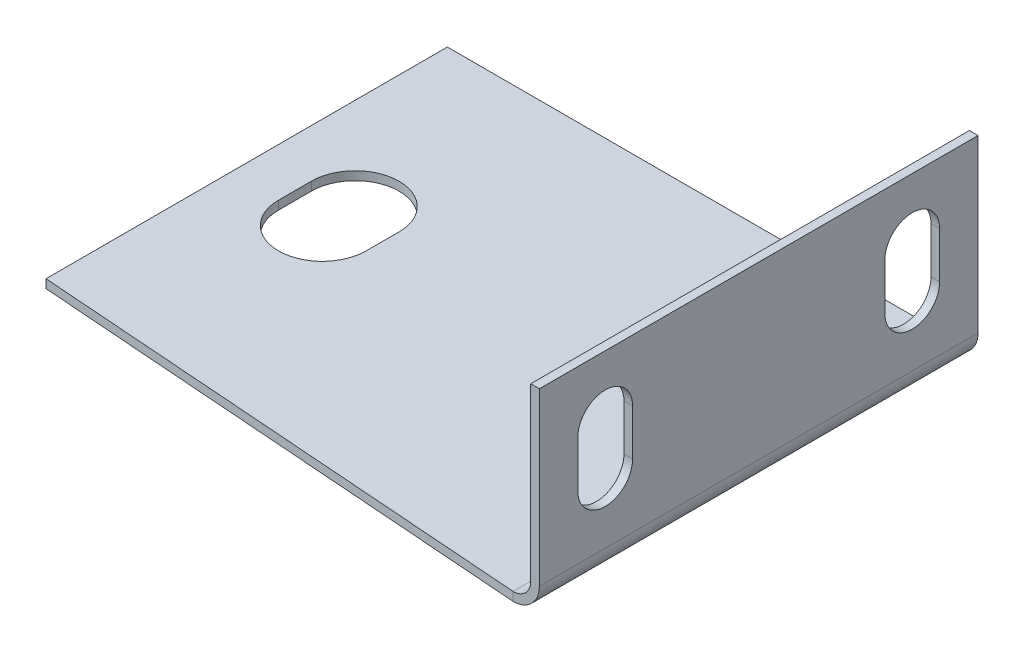
ISO-10303-21;
HEADER;
FILE_DESCRIPTION(('STEP AP214'),'2;1');
FILE_NAME('part.step','',(''),(''),'','','');
FILE_SCHEMA(('AUTOMOTIVE_DESIGN { 1 0 10303 214 1 1 1 1 }'));
ENDSEC;
DATA;
#1=APPLICATION_CONTEXT('core data for automotive mechanical design processes');
#2=APPLICATION_PROTOCOL_DEFINITION('international standard','automotive_design',2000,#1);
#3=PRODUCT_CONTEXT('',#1,'mechanical');
#4=PRODUCT('Part','Part','',(#3));
#5=PRODUCT_RELATED_PRODUCT_CATEGORY('part','',(#4));
#6=PRODUCT_DEFINITION_FORMATION('','',#4);
#7=PRODUCT_DEFINITION_CONTEXT('part definition',#1,'design');
#8=PRODUCT_DEFINITION('design','',#6,#7);
#9=PRODUCT_DEFINITION_SHAPE('','',#8);
#10=(LENGTH_UNIT() NAMED_UNIT(*) SI_UNIT(.MILLI.,.METRE.));
#11=(NAMED_UNIT(*) PLANE_ANGLE_UNIT() SI_UNIT($,.RADIAN.));
#12=(NAMED_UNIT(*) SI_UNIT($,.STERADIAN.) SOLID_ANGLE_UNIT());
#13=UNCERTAINTY_MEASURE_WITH_UNIT(LENGTH_MEASURE(1.E-05),#10,'distance_accuracy_value','');
#14=(GEOMETRIC_REPRESENTATION_CONTEXT(3) GLOBAL_UNCERTAINTY_ASSIGNED_CONTEXT((#13)) GLOBAL_UNIT_ASSIGNED_CONTEXT((#10,
#11,#12)) REPRESENTATION_CONTEXT('',''));
#15=CARTESIAN_POINT('',(0.,0.,0.));
#16=DIRECTION('',(0.,0.,1.));
#17=DIRECTION('',(1.,0.,0.));
#18=AXIS2_PLACEMENT_3D('',#15,#16,#17);
#19=CARTESIAN_POINT('',(30.73,1.27,25.4));
#20=DIRECTION('',(-1.,0.,0.));
#21=DIRECTION('',(0.,0.,1.));
#22=AXIS2_PLACEMENT_3D('',#19,#20,#21);
#23=PLANE('',#22);
#24=DIRECTION('',(0.,1.,0.));
#25=VECTOR('',#24,1.);
#26=CARTESIAN_POINT('',(30.73,4.95299999999999,20.0025));
#27=LINE('',#26,#25);
#28=CARTESIAN_POINT('',(30.73,4.95299999999999,20.0025));
#29=VERTEX_POINT('',#28);
#30=CARTESIAN_POINT('',(30.73,7.62,20.0025));
#31=VERTEX_POINT('',#30);
#32=EDGE_CURVE('E365',#29,#31,#27,.T.);
#33=ORIENTED_EDGE('',*,*,#32,.F.);
#34=CARTESIAN_POINT('',(30.73,4.953,21.59));
#35=DIRECTION('',(1.,0.,0.));
#36=DIRECTION('',(0.,0.,1.));
#37=AXIS2_PLACEMENT_3D('',#34,#35,#36);
#38=CIRCLE('',#37,1.5875);
#39=CARTESIAN_POINT('',(30.73,4.95299999999999,23.1775));
#40=VERTEX_POINT('',#39);
#41=EDGE_CURVE('E251',#40,#29,#38,.T.);
#42=ORIENTED_EDGE('',*,*,#41,.F.);
#43=DIRECTION('',(0.,-1.,0.));
#44=VECTOR('',#43,1.);
#45=CARTESIAN_POINT('',(30.73,4.95299999999999,23.1775));
#46=LINE('',#45,#44);
#47=CARTESIAN_POINT('',(30.73,7.62,23.1775));
#48=VERTEX_POINT('',#47);
#49=EDGE_CURVE('E252',#48,#40,#46,.T.);
#50=ORIENTED_EDGE('',*,*,#49,.F.);
#51=CARTESIAN_POINT('',(30.73,7.62,21.59));
#52=DIRECTION('',(1.,0.,0.));
#53=DIRECTION('',(0.,0.,1.));
#54=AXIS2_PLACEMENT_3D('',#51,#52,#53);
#55=CIRCLE('',#54,1.5875);
#56=EDGE_CURVE('E235',#31,#48,#55,.T.);
#57=ORIENTED_EDGE('',*,*,#56,.F.);
#58=EDGE_LOOP('',(#33,#42,#50,#57));
#59=FACE_BOUND('',#58,.T.);
#60=DIRECTION('',(0.,1.,0.));
#61=VECTOR('',#60,1.);
#62=CARTESIAN_POINT('',(30.73,4.95299999999999,2.2225));
#63=LINE('',#62,#61);
#64=CARTESIAN_POINT('',(30.73,4.95299999999999,2.2225));
#65=VERTEX_POINT('',#64);
#66=CARTESIAN_POINT('',(30.73,7.62000000000001,2.2225));
#67=VERTEX_POINT('',#66);
#68=EDGE_CURVE('E259',#65,#67,#63,.T.);
#69=ORIENTED_EDGE('',*,*,#68,.F.);
#70=CARTESIAN_POINT('',(30.73,4.953,3.81));
#71=DIRECTION('',(1.,0.,0.));
#72=DIRECTION('',(0.,0.,-1.));
#73=AXIS2_PLACEMENT_3D('',#70,#71,#72);
#74=CIRCLE('',#73,1.5875);
#75=CARTESIAN_POINT('',(30.73,4.953,5.3975));
#76=VERTEX_POINT('',#75);
#77=EDGE_CURVE('E257',#76,#65,#74,.T.);
#78=ORIENTED_EDGE('',*,*,#77,.F.);
#79=DIRECTION('',(0.,-1.,0.));
#80=VECTOR('',#79,1.);
#81=CARTESIAN_POINT('',(30.73,4.953,5.3975));
#82=LINE('',#81,#80);
#83=CARTESIAN_POINT('',(30.73,7.62,5.3975));
#84=VERTEX_POINT('',#83);
#85=EDGE_CURVE('E265',#84,#76,#82,.T.);
#86=ORIENTED_EDGE('',*,*,#85,.F.);
#87=CARTESIAN_POINT('',(30.73,7.62,3.81));
#88=DIRECTION('',(1.,0.,0.));
#89=DIRECTION('',(0.,0.,-1.));
#90=AXIS2_PLACEMENT_3D('',#87,#88,#89);
#91=CIRCLE('',#90,1.5875);
#92=EDGE_CURVE('E262',#67,#84,#91,.T.);
#93=ORIENTED_EDGE('',*,*,#92,.F.);
#94=EDGE_LOOP('',(#69,#78,#86,#93));
#95=FACE_BOUND('',#94,.T.);
#96=DIRECTION('',(0.,1.,0.));
#97=VECTOR('',#96,1.);
#98=CARTESIAN_POINT('',(30.73,1.27,0.));
#99=LINE('',#98,#97);
#100=CARTESIAN_POINT('',(30.73,1.27,0.));
#101=VERTEX_POINT('',#100);
#102=CARTESIAN_POINT('',(30.73,11.176,0.));
#103=VERTEX_POINT('',#102);
#104=EDGE_CURVE('E271',#101,#103,#99,.T.);
#105=ORIENTED_EDGE('',*,*,#104,.T.);
#106=DIRECTION('',(0.,0.,-1.));
#107=VECTOR('',#106,1.);
#108=CARTESIAN_POINT('',(30.73,11.176,25.4));
#109=LINE('',#108,#107);
#110=CARTESIAN_POINT('',(30.73,11.176,25.4));
#111=VERTEX_POINT('',#110);
#112=EDGE_CURVE('E204',#111,#103,#109,.T.);
#113=ORIENTED_EDGE('',*,*,#112,.F.);
#114=DIRECTION('',(0.,1.,0.));
#115=VECTOR('',#114,1.);
#116=CARTESIAN_POINT('',(30.73,1.27,25.4));
#117=LINE('',#116,#115);
#118=CARTESIAN_POINT('',(30.73,1.27,25.4));
#119=VERTEX_POINT('',#118);
#120=EDGE_CURVE('E278',#119,#111,#117,.T.);
#121=ORIENTED_EDGE('',*,*,#120,.F.);
#122=DIRECTION('',(0.,0.,-1.));
#123=VECTOR('',#122,1.);
#124=CARTESIAN_POINT('',(30.73,1.27,25.4));
#125=LINE('',#124,#123);
#126=EDGE_CURVE('E195',#119,#101,#125,.T.);
#127=ORIENTED_EDGE('',*,*,#126,.T.);
#128=EDGE_LOOP('',(#105,#113,#121,#127));
#129=FACE_BOUND('',#128,.T.);
#130=ADVANCED_FACE('F32',(#59,#95,#129),#23,.F.);
#131=CARTESIAN_POINT('',(30.23,11.176,25.4));
#132=DIRECTION('',(0.,1.,0.));
#133=DIRECTION('',(0.,0.,1.));
#134=AXIS2_PLACEMENT_3D('',#131,#132,#133);
#135=PLANE('',#134);
#136=DIRECTION('',(1.,0.,0.));
#137=VECTOR('',#136,1.);
#138=CARTESIAN_POINT('',(30.23,11.176,0.));
#139=LINE('',#138,#137);
#140=CARTESIAN_POINT('',(30.23,11.176,0.));
#141=VERTEX_POINT('',#140);
#142=EDGE_CURVE('E294',#141,#103,#139,.T.);
#143=ORIENTED_EDGE('',*,*,#142,.F.);
#144=DIRECTION('',(0.,0.,-1.));
#145=VECTOR('',#144,1.);
#146=CARTESIAN_POINT('',(30.23,11.176,25.4));
#147=LINE('',#146,#145);
#148=CARTESIAN_POINT('',(30.23,11.176,25.4));
#149=VERTEX_POINT('',#148);
#150=EDGE_CURVE('E202',#149,#141,#147,.T.);
#151=ORIENTED_EDGE('',*,*,#150,.F.);
#152=DIRECTION('',(1.,0.,0.));
#153=VECTOR('',#152,1.);
#154=CARTESIAN_POINT('',(30.23,11.176,25.4));
#155=LINE('',#154,#153);
#156=EDGE_CURVE('E280',#149,#111,#155,.T.);
#157=ORIENTED_EDGE('',*,*,#156,.T.);
#158=ORIENTED_EDGE('',*,*,#112,.T.);
#159=EDGE_LOOP('',(#143,#151,#157,#158));
#160=FACE_BOUND('',#159,.T.);
#161=ADVANCED_FACE('F322',(#160),#135,.T.);
#162=CARTESIAN_POINT('',(30.23,1.27,25.4));
#163=DIRECTION('',(-1.,0.,0.));
#164=DIRECTION('',(0.,0.,1.));
#165=AXIS2_PLACEMENT_3D('',#162,#163,#164);
#166=PLANE('',#165);
#167=CARTESIAN_POINT('',(30.23,4.953,21.59));
#168=DIRECTION('',(-1.,0.,0.));
#169=DIRECTION('',(0.,0.,1.));
#170=AXIS2_PLACEMENT_3D('',#167,#168,#169);
#171=CIRCLE('',#170,1.5875);
#172=CARTESIAN_POINT('',(30.23,4.95299999999999,20.0025));
#173=VERTEX_POINT('',#172);
#174=CARTESIAN_POINT('',(30.23,4.95299999999999,23.1775));
#175=VERTEX_POINT('',#174);
#176=EDGE_CURVE('E11',#173,#175,#171,.T.);
#177=ORIENTED_EDGE('',*,*,#176,.F.);
#178=DIRECTION('',(0.,-1.,0.));
#179=VECTOR('',#178,1.);
#180=CARTESIAN_POINT('',(30.23,1.27,20.0025));
#181=LINE('',#180,#179);
#182=CARTESIAN_POINT('',(30.23,7.62,20.0025));
#183=VERTEX_POINT('',#182);
#184=EDGE_CURVE('E215',#183,#173,#181,.T.);
#185=ORIENTED_EDGE('',*,*,#184,.F.);
#186=CARTESIAN_POINT('',(30.23,7.62,21.59));
#187=DIRECTION('',(-1.,0.,0.));
#188=DIRECTION('',(0.,0.,1.));
#189=AXIS2_PLACEMENT_3D('',#186,#187,#188);
#190=CIRCLE('',#189,1.5875);
#191=CARTESIAN_POINT('',(30.23,7.62,23.1775));
#192=VERTEX_POINT('',#191);
#193=EDGE_CURVE('E217',#192,#183,#190,.T.);
#194=ORIENTED_EDGE('',*,*,#193,.F.);
#195=DIRECTION('',(0.,1.,0.));
#196=VECTOR('',#195,1.);
#197=CARTESIAN_POINT('',(30.23,1.27,23.1775));
#198=LINE('',#197,#196);
#199=EDGE_CURVE('E39',#175,#192,#198,.T.);
#200=ORIENTED_EDGE('',*,*,#199,.F.);
#201=EDGE_LOOP('',(#177,#185,#194,#200));
#202=FACE_BOUND('',#201,.T.);
#203=CARTESIAN_POINT('',(30.23,4.953,3.81));
#204=DIRECTION('',(-1.,0.,0.));
#205=DIRECTION('',(0.,0.,1.));
#206=AXIS2_PLACEMENT_3D('',#203,#204,#205);
#207=CIRCLE('',#206,1.5875);
#208=CARTESIAN_POINT('',(30.23,4.95299999999999,2.2225));
#209=VERTEX_POINT('',#208);
#210=CARTESIAN_POINT('',(30.23,4.953,5.3975));
#211=VERTEX_POINT('',#210);
#212=EDGE_CURVE('E213',#209,#211,#207,.T.);
#213=ORIENTED_EDGE('',*,*,#212,.F.);
#214=DIRECTION('',(0.,-1.,0.));
#215=VECTOR('',#214,1.);
#216=CARTESIAN_POINT('',(30.23,1.27,2.2225));
#217=LINE('',#216,#215);
#218=CARTESIAN_POINT('',(30.23,7.62000000000001,2.2225));
#219=VERTEX_POINT('',#218);
#220=EDGE_CURVE('E206',#219,#209,#217,.T.);
#221=ORIENTED_EDGE('',*,*,#220,.F.);
#222=CARTESIAN_POINT('',(30.23,7.62,3.81));
#223=DIRECTION('',(-1.,0.,0.));
#224=DIRECTION('',(0.,0.,1.));
#225=AXIS2_PLACEMENT_3D('',#222,#223,#224);
#226=CIRCLE('',#225,1.5875);
#227=CARTESIAN_POINT('',(30.23,7.62,5.3975));
#228=VERTEX_POINT('',#227);
#229=EDGE_CURVE('E208',#228,#219,#226,.T.);
#230=ORIENTED_EDGE('',*,*,#229,.F.);
#231=DIRECTION('',(0.,1.,0.));
#232=VECTOR('',#231,1.);
#233=CARTESIAN_POINT('',(30.23,1.27000000000001,5.3975));
#234=LINE('',#233,#232);
#235=EDGE_CURVE('E211',#211,#228,#234,.T.);
#236=ORIENTED_EDGE('',*,*,#235,.F.);
#237=EDGE_LOOP('',(#213,#221,#230,#236));
#238=FACE_BOUND('',#237,.T.);
#239=DIRECTION('',(0.,1.,0.));
#240=VECTOR('',#239,1.);
#241=CARTESIAN_POINT('',(30.23,1.27,0.));
#242=LINE('',#241,#240);
#243=CARTESIAN_POINT('',(30.23,1.27,0.));
#244=VERTEX_POINT('',#243);
#245=EDGE_CURVE('E297',#244,#141,#242,.T.);
#246=ORIENTED_EDGE('',*,*,#245,.F.);
#247=DIRECTION('',(0.,0.,-1.));
#248=VECTOR('',#247,1.);
#249=CARTESIAN_POINT('',(30.23,1.27,25.4));
#250=LINE('',#249,#248);
#251=CARTESIAN_POINT('',(30.23,1.27,25.4));
#252=VERTEX_POINT('',#251);
#253=EDGE_CURVE('E200',#252,#244,#250,.T.);
#254=ORIENTED_EDGE('',*,*,#253,.F.);
#255=DIRECTION('',(0.,1.,0.));
#256=VECTOR('',#255,1.);
#257=CARTESIAN_POINT('',(30.23,1.27,25.4));
#258=LINE('',#257,#256);
#259=EDGE_CURVE('E284',#252,#149,#258,.T.);
#260=ORIENTED_EDGE('',*,*,#259,.T.);
#261=ORIENTED_EDGE('',*,*,#150,.T.);
#262=EDGE_LOOP('',(#246,#254,#260,#261));
#263=FACE_BOUND('',#262,.T.);
#264=ADVANCED_FACE('F239',(#202,#238,#263),#166,.T.);
#265=CARTESIAN_POINT('',(29.21,1.27,25.4));
#266=DIRECTION('',(0.,0.,-1.));
#267=DIRECTION('',(-1.,0.,0.));
#268=AXIS2_PLACEMENT_3D('',#265,#266,#267);
#269=CYLINDRICAL_SURFACE('',#268,1.02);
#270=CARTESIAN_POINT('',(29.21,1.27,0.));
#271=DIRECTION('',(0.,0.,1.));
#272=DIRECTION('',(1.,0.,0.));
#273=AXIS2_PLACEMENT_3D('',#270,#271,#272);
#274=CIRCLE('',#273,1.02);
#275=CARTESIAN_POINT('',(29.21,0.25,0.));
#276=VERTEX_POINT('',#275);
#277=EDGE_CURVE('E300',#276,#244,#274,.T.);
#278=ORIENTED_EDGE('',*,*,#277,.F.);
#279=DIRECTION('',(0.,0.,-1.));
#280=VECTOR('',#279,1.);
#281=CARTESIAN_POINT('',(29.21,0.25,25.4));
#282=LINE('',#281,#280);
#283=CARTESIAN_POINT('',(29.21,0.25,25.4));
#284=VERTEX_POINT('',#283);
#285=EDGE_CURVE('E193',#284,#276,#282,.T.);
#286=ORIENTED_EDGE('',*,*,#285,.F.);
#287=CARTESIAN_POINT('',(29.21,1.27,25.4));
#288=DIRECTION('',(0.,0.,1.));
#289=DIRECTION('',(1.,0.,0.));
#290=AXIS2_PLACEMENT_3D('',#287,#288,#289);
#291=CIRCLE('',#290,1.02);
#292=EDGE_CURVE('E287',#284,#252,#291,.T.);
#293=ORIENTED_EDGE('',*,*,#292,.T.);
#294=ORIENTED_EDGE('',*,*,#253,.T.);
#295=EDGE_LOOP('',(#278,#286,#293,#294));
#296=FACE_BOUND('',#295,.T.);
#297=ADVANCED_FACE('F331',(#296),#269,.F.);
#298=CARTESIAN_POINT('',(0.,0.25,25.4));
#299=DIRECTION('',(0.,1.,0.));
#300=DIRECTION('',(0.,0.,1.));
#301=AXIS2_PLACEMENT_3D('',#298,#299,#300);
#302=PLANE('',#301);
#303=DIRECTION('',(-0.997279572494263,0.,-0.0737119684017498));
#304=VECTOR('',#303,1.);
#305=CARTESIAN_POINT('',(0.,0.25,23.241));
#306=LINE('',#305,#304);
#307=CARTESIAN_POINT('',(0.,0.25,23.241));
#308=VERTEX_POINT('',#307);
#309=EDGE_CURVE('E172',#284,#308,#306,.T.);
#310=ORIENTED_EDGE('',*,*,#309,.F.);
#311=ORIENTED_EDGE('',*,*,#285,.T.);
#312=DIRECTION('',(1.,0.,0.));
#313=VECTOR('',#312,1.);
#314=CARTESIAN_POINT('',(0.,0.25,0.));
#315=LINE('',#314,#313);
#316=CARTESIAN_POINT('',(0.,0.25,0.));
#317=VERTEX_POINT('',#316);
#318=EDGE_CURVE('E303',#317,#276,#315,.T.);
#319=ORIENTED_EDGE('',*,*,#318,.F.);
#320=DIRECTION('',(0.,0.,-1.));
#321=VECTOR('',#320,1.);
#322=CARTESIAN_POINT('',(0.,0.25,25.4));
#323=LINE('',#322,#321);
#324=EDGE_CURVE('E191',#308,#317,#323,.T.);
#325=ORIENTED_EDGE('',*,*,#324,.F.);
#326=EDGE_LOOP('',(#310,#311,#319,#325));
#327=FACE_BOUND('',#326,.T.);
#328=CARTESIAN_POINT('',(5.334,0.25,12.573));
#329=DIRECTION('',(0.,1.,0.));
#330=DIRECTION('',(0.,0.,1.));
#331=AXIS2_PLACEMENT_3D('',#328,#329,#330);
#332=CIRCLE('',#331,2.54);
#333=CARTESIAN_POINT('',(2.794,0.25,12.573));
#334=VERTEX_POINT('',#333);
#335=CARTESIAN_POINT('',(7.874,0.25,12.573));
#336=VERTEX_POINT('',#335);
#337=EDGE_CURVE('E46',#334,#336,#332,.T.);
#338=ORIENTED_EDGE('',*,*,#337,.F.);
#339=DIRECTION('',(0.,0.,1.));
#340=VECTOR('',#339,1.);
#341=CARTESIAN_POINT('',(2.794,0.25,12.573));
#342=LINE('',#341,#340);
#343=CARTESIAN_POINT('',(2.794,0.25,10.668));
#344=VERTEX_POINT('',#343);
#345=EDGE_CURVE('E342',#344,#334,#342,.T.);
#346=ORIENTED_EDGE('',*,*,#345,.F.);
#347=CARTESIAN_POINT('',(5.334,0.25,10.668));
#348=DIRECTION('',(0.,1.,0.));
#349=DIRECTION('',(0.,0.,1.));
#350=AXIS2_PLACEMENT_3D('',#347,#348,#349);
#351=CIRCLE('',#350,2.54);
#352=CARTESIAN_POINT('',(7.874,0.25,10.668));
#353=VERTEX_POINT('',#352);
#354=EDGE_CURVE('E352',#353,#344,#351,.T.);
#355=ORIENTED_EDGE('',*,*,#354,.F.);
#356=DIRECTION('',(0.,0.,-1.));
#357=VECTOR('',#356,1.);
#358=CARTESIAN_POINT('',(7.874,0.25,12.573));
#359=LINE('',#358,#357);
#360=EDGE_CURVE('E334',#336,#353,#359,.T.);
#361=ORIENTED_EDGE('',*,*,#360,.F.);
#362=EDGE_LOOP('',(#338,#346,#355,#361));
#363=FACE_BOUND('',#362,.T.);
#364=ADVANCED_FACE('F414',(#327,#363),#302,.T.);
#365=CARTESIAN_POINT('',(0.,-0.25,25.4));
#366=DIRECTION('',(-1.,0.,0.));
#367=DIRECTION('',(0.,0.,1.));
#368=AXIS2_PLACEMENT_3D('',#365,#366,#367);
#369=PLANE('',#368);
#370=DIRECTION('',(0.,1.,0.));
#371=VECTOR('',#370,1.);
#372=CARTESIAN_POINT('',(0.,-0.25,23.241));
#373=LINE('',#372,#371);
#374=CARTESIAN_POINT('',(0.,-0.25,23.241));
#375=VERTEX_POINT('',#374);
#376=EDGE_CURVE('E166',#375,#308,#373,.T.);
#377=ORIENTED_EDGE('',*,*,#376,.T.);
#378=ORIENTED_EDGE('',*,*,#324,.T.);
#379=DIRECTION('',(0.,1.,0.));
#380=VECTOR('',#379,1.);
#381=CARTESIAN_POINT('',(0.,-0.25,0.));
#382=LINE('',#381,#380);
#383=CARTESIAN_POINT('',(0.,-0.25,0.));
#384=VERTEX_POINT('',#383);
#385=EDGE_CURVE('E190',#384,#317,#382,.T.);
#386=ORIENTED_EDGE('',*,*,#385,.F.);
#387=DIRECTION('',(0.,0.,-1.));
#388=VECTOR('',#387,1.);
#389=CARTESIAN_POINT('',(0.,-0.25,25.4));
#390=LINE('',#389,#388);
#391=EDGE_CURVE('E181',#375,#384,#390,.T.);
#392=ORIENTED_EDGE('',*,*,#391,.F.);
#393=EDGE_LOOP('',(#377,#378,#386,#392));
#394=FACE_BOUND('',#393,.T.);
#395=ADVANCED_FACE('F188',(#394),#369,.T.);
#396=CARTESIAN_POINT('',(0.,-0.25,25.4));
#397=DIRECTION('',(0.,1.,0.));
#398=DIRECTION('',(0.,0.,1.));
#399=AXIS2_PLACEMENT_3D('',#396,#397,#398);
#400=PLANE('',#399);
#401=DIRECTION('',(0.,0.,1.));
#402=VECTOR('',#401,1.);
#403=CARTESIAN_POINT('',(2.794,-0.25,12.573));
#404=LINE('',#403,#402);
#405=CARTESIAN_POINT('',(2.794,-0.25,10.668));
#406=VERTEX_POINT('',#405);
#407=CARTESIAN_POINT('',(2.794,-0.25,12.573));
#408=VERTEX_POINT('',#407);
#409=EDGE_CURVE('E346',#406,#408,#404,.T.);
#410=ORIENTED_EDGE('',*,*,#409,.T.);
#411=CARTESIAN_POINT('',(5.334,-0.25,12.573));
#412=DIRECTION('',(0.,1.,0.));
#413=DIRECTION('',(0.,0.,1.));
#414=AXIS2_PLACEMENT_3D('',#411,#412,#413);
#415=CIRCLE('',#414,2.54);
#416=CARTESIAN_POINT('',(7.874,-0.25,12.573));
#417=VERTEX_POINT('',#416);
#418=EDGE_CURVE('E338',#408,#417,#415,.T.);
#419=ORIENTED_EDGE('',*,*,#418,.T.);
#420=DIRECTION('',(0.,0.,-1.));
#421=VECTOR('',#420,1.);
#422=CARTESIAN_POINT('',(7.874,-0.25,12.573));
#423=LINE('',#422,#421);
#424=CARTESIAN_POINT('',(7.874,-0.25,10.668));
#425=VERTEX_POINT('',#424);
#426=EDGE_CURVE('E341',#417,#425,#423,.T.);
#427=ORIENTED_EDGE('',*,*,#426,.T.);
#428=CARTESIAN_POINT('',(5.334,-0.25,10.668));
#429=DIRECTION('',(0.,1.,0.));
#430=DIRECTION('',(0.,0.,1.));
#431=AXIS2_PLACEMENT_3D('',#428,#429,#430);
#432=CIRCLE('',#431,2.54);
#433=EDGE_CURVE('E54',#425,#406,#432,.T.);
#434=ORIENTED_EDGE('',*,*,#433,.T.);
#435=EDGE_LOOP('',(#410,#419,#427,#434));
#436=FACE_BOUND('',#435,.T.);
#437=DIRECTION('',(0.,0.,-1.));
#438=VECTOR('',#437,1.);
#439=CARTESIAN_POINT('',(29.21,-0.25,25.4));
#440=LINE('',#439,#438);
#441=CARTESIAN_POINT('',(29.21,-0.25,25.4));
#442=VERTEX_POINT('',#441);
#443=CARTESIAN_POINT('',(29.21,-0.25,0.));
#444=VERTEX_POINT('',#443);
#445=EDGE_CURVE('E184',#442,#444,#440,.T.);
#446=ORIENTED_EDGE('',*,*,#445,.F.);
#447=DIRECTION('',(-0.997279572494263,0.,-0.0737119684017498));
#448=VECTOR('',#447,1.);
#449=CARTESIAN_POINT('',(0.,-0.25,23.241));
#450=LINE('',#449,#448);
#451=EDGE_CURVE('E169',#442,#375,#450,.T.);
#452=ORIENTED_EDGE('',*,*,#451,.T.);
#453=ORIENTED_EDGE('',*,*,#391,.T.);
#454=DIRECTION('',(1.,0.,0.));
#455=VECTOR('',#454,1.);
#456=CARTESIAN_POINT('',(0.,-0.25,0.));
#457=LINE('',#456,#455);
#458=EDGE_CURVE('E307',#384,#444,#457,.T.);
#459=ORIENTED_EDGE('',*,*,#458,.T.);
#460=EDGE_LOOP('',(#446,#452,#453,#459));
#461=FACE_BOUND('',#460,.T.);
#462=ADVANCED_FACE('F180',(#436,#461),#400,.F.);
#463=CARTESIAN_POINT('',(29.21,1.27,25.4));
#464=DIRECTION('',(0.,0.,-1.));
#465=DIRECTION('',(-1.,0.,0.));
#466=AXIS2_PLACEMENT_3D('',#463,#464,#465);
#467=CYLINDRICAL_SURFACE('',#466,1.52);
#468=CARTESIAN_POINT('',(29.21,1.27,0.));
#469=DIRECTION('',(0.,0.,1.));
#470=DIRECTION('',(1.,0.,0.));
#471=AXIS2_PLACEMENT_3D('',#468,#469,#470);
#472=CIRCLE('',#471,1.52);
#473=EDGE_CURVE('E281',#444,#101,#472,.T.);
#474=ORIENTED_EDGE('',*,*,#473,.T.);
#475=ORIENTED_EDGE('',*,*,#126,.F.);
#476=CARTESIAN_POINT('',(29.21,1.27,25.4));
#477=DIRECTION('',(0.,0.,1.));
#478=DIRECTION('',(1.,0.,0.));
#479=AXIS2_PLACEMENT_3D('',#476,#477,#478);
#480=CIRCLE('',#479,1.52);
#481=EDGE_CURVE('E290',#442,#119,#480,.T.);
#482=ORIENTED_EDGE('',*,*,#481,.F.);
#483=ORIENTED_EDGE('',*,*,#445,.T.);
#484=EDGE_LOOP('',(#474,#475,#482,#483));
#485=FACE_BOUND('',#484,.T.);
#486=ADVANCED_FACE('F404',(#485),#467,.T.);
#487=CARTESIAN_POINT('',(29.21,1.27,25.4));
#488=DIRECTION('',(0.,0.,1.));
#489=DIRECTION('',(1.,0.,0.));
#490=AXIS2_PLACEMENT_3D('',#487,#488,#489);
#491=PLANE('',#490);
#492=DIRECTION('',(0.,1.,0.));
#493=VECTOR('',#492,1.);
#494=CARTESIAN_POINT('',(29.21,-0.25,25.4));
#495=LINE('',#494,#493);
#496=EDGE_CURVE('E176',#442,#284,#495,.T.);
#497=ORIENTED_EDGE('',*,*,#496,.F.);
#498=ORIENTED_EDGE('',*,*,#481,.T.);
#499=ORIENTED_EDGE('',*,*,#120,.T.);
#500=ORIENTED_EDGE('',*,*,#156,.F.);
#501=ORIENTED_EDGE('',*,*,#259,.F.);
#502=ORIENTED_EDGE('',*,*,#292,.F.);
#503=EDGE_LOOP('',(#497,#498,#499,#500,#501,#502));
#504=FACE_BOUND('',#503,.T.);
#505=ADVANCED_FACE('F326',(#504),#491,.T.);
#506=CARTESIAN_POINT('',(29.21,1.27,0.));
#507=DIRECTION('',(0.,0.,1.));
#508=DIRECTION('',(1.,0.,0.));
#509=AXIS2_PLACEMENT_3D('',#506,#507,#508);
#510=PLANE('',#509);
#511=ORIENTED_EDGE('',*,*,#104,.F.);
#512=ORIENTED_EDGE('',*,*,#473,.F.);
#513=ORIENTED_EDGE('',*,*,#458,.F.);
#514=ORIENTED_EDGE('',*,*,#385,.T.);
#515=ORIENTED_EDGE('',*,*,#318,.T.);
#516=ORIENTED_EDGE('',*,*,#277,.T.);
#517=ORIENTED_EDGE('',*,*,#245,.T.);
#518=ORIENTED_EDGE('',*,*,#142,.T.);
#519=EDGE_LOOP('',(#511,#512,#513,#514,#515,#516,#517,#518));
#520=FACE_BOUND('',#519,.T.);
#521=ADVANCED_FACE('F318',(#520),#510,.F.);
#522=CARTESIAN_POINT('',(0.,4.953,3.81));
#523=DIRECTION('',(1.,0.,0.));
#524=DIRECTION('',(0.,0.,-1.));
#525=AXIS2_PLACEMENT_3D('',#522,#523,#524);
#526=CYLINDRICAL_SURFACE('',#525,1.5875);
#527=ORIENTED_EDGE('',*,*,#212,.T.);
#528=DIRECTION('',(1.,0.,0.));
#529=VECTOR('',#528,1.);
#530=CARTESIAN_POINT('',(0.,4.953,5.3975));
#531=LINE('',#530,#529);
#532=EDGE_CURVE('E269',#211,#76,#531,.T.);
#533=ORIENTED_EDGE('',*,*,#532,.T.);
#534=ORIENTED_EDGE('',*,*,#77,.T.);
#535=DIRECTION('',(1.,0.,0.));
#536=VECTOR('',#535,1.);
#537=CARTESIAN_POINT('',(0.,4.95299999999999,2.2225));
#538=LINE('',#537,#536);
#539=EDGE_CURVE('E268',#209,#65,#538,.T.);
#540=ORIENTED_EDGE('',*,*,#539,.F.);
#541=EDGE_LOOP('',(#527,#533,#534,#540));
#542=FACE_BOUND('',#541,.T.);
#543=ADVANCED_FACE('F381',(#542),#526,.F.);
#544=CARTESIAN_POINT('',(0.,4.953,5.3975));
#545=DIRECTION('',(0.,0.,1.));
#546=DIRECTION('',(0.,-1.,0.));
#547=AXIS2_PLACEMENT_3D('',#544,#545,#546);
#548=PLANE('',#547);
#549=ORIENTED_EDGE('',*,*,#235,.T.);
#550=DIRECTION('',(1.,0.,0.));
#551=VECTOR('',#550,1.);
#552=CARTESIAN_POINT('',(0.,7.62,5.3975));
#553=LINE('',#552,#551);
#554=EDGE_CURVE('E272',#228,#84,#553,.T.);
#555=ORIENTED_EDGE('',*,*,#554,.T.);
#556=ORIENTED_EDGE('',*,*,#85,.T.);
#557=ORIENTED_EDGE('',*,*,#532,.F.);
#558=EDGE_LOOP('',(#549,#555,#556,#557));
#559=FACE_BOUND('',#558,.T.);
#560=ADVANCED_FACE('F387',(#559),#548,.F.);
#561=CARTESIAN_POINT('',(0.,7.62,3.81));
#562=DIRECTION('',(1.,0.,0.));
#563=DIRECTION('',(0.,0.,-1.));
#564=AXIS2_PLACEMENT_3D('',#561,#562,#563);
#565=CYLINDRICAL_SURFACE('',#564,1.5875);
#566=ORIENTED_EDGE('',*,*,#229,.T.);
#567=DIRECTION('',(1.,0.,0.));
#568=VECTOR('',#567,1.);
#569=CARTESIAN_POINT('',(0.,7.62000000000001,2.2225));
#570=LINE('',#569,#568);
#571=EDGE_CURVE('E274',#219,#67,#570,.T.);
#572=ORIENTED_EDGE('',*,*,#571,.T.);
#573=ORIENTED_EDGE('',*,*,#92,.T.);
#574=ORIENTED_EDGE('',*,*,#554,.F.);
#575=EDGE_LOOP('',(#566,#572,#573,#574));
#576=FACE_BOUND('',#575,.T.);
#577=ADVANCED_FACE('F389',(#576),#565,.F.);
#578=CARTESIAN_POINT('',(0.,4.95299999999999,2.2225));
#579=DIRECTION('',(0.,0.,-1.));
#580=DIRECTION('',(0.,1.,0.));
#581=AXIS2_PLACEMENT_3D('',#578,#579,#580);
#582=PLANE('',#581);
#583=ORIENTED_EDGE('',*,*,#220,.T.);
#584=ORIENTED_EDGE('',*,*,#539,.T.);
#585=ORIENTED_EDGE('',*,*,#68,.T.);
#586=ORIENTED_EDGE('',*,*,#571,.F.);
#587=EDGE_LOOP('',(#583,#584,#585,#586));
#588=FACE_BOUND('',#587,.T.);
#589=ADVANCED_FACE('F376',(#588),#582,.F.);
#590=CARTESIAN_POINT('',(0.,4.953,21.59));
#591=DIRECTION('',(1.,0.,0.));
#592=DIRECTION('',(0.,0.,-1.));
#593=AXIS2_PLACEMENT_3D('',#590,#591,#592);
#594=CYLINDRICAL_SURFACE('',#593,1.5875);
#595=ORIENTED_EDGE('',*,*,#176,.T.);
#596=DIRECTION('',(1.,0.,0.));
#597=VECTOR('',#596,1.);
#598=CARTESIAN_POINT('',(0.,4.95299999999999,23.1775));
#599=LINE('',#598,#597);
#600=EDGE_CURVE('E227',#175,#40,#599,.T.);
#601=ORIENTED_EDGE('',*,*,#600,.T.);
#602=ORIENTED_EDGE('',*,*,#41,.T.);
#603=DIRECTION('',(1.,0.,0.));
#604=VECTOR('',#603,1.);
#605=CARTESIAN_POINT('',(0.,4.95299999999999,20.0025));
#606=LINE('',#605,#604);
#607=EDGE_CURVE('E246',#173,#29,#606,.T.);
#608=ORIENTED_EDGE('',*,*,#607,.F.);
#609=EDGE_LOOP('',(#595,#601,#602,#608));
#610=FACE_BOUND('',#609,.T.);
#611=ADVANCED_FACE('F249',(#610),#594,.F.);
#612=CARTESIAN_POINT('',(0.,4.95299999999999,23.1775));
#613=DIRECTION('',(0.,0.,1.));
#614=DIRECTION('',(1.,0.,0.));
#615=AXIS2_PLACEMENT_3D('',#612,#613,#614);
#616=PLANE('',#615);
#617=ORIENTED_EDGE('',*,*,#199,.T.);
#618=DIRECTION('',(1.,0.,0.));
#619=VECTOR('',#618,1.);
#620=CARTESIAN_POINT('',(0.,7.62,23.1775));
#621=LINE('',#620,#619);
#622=EDGE_CURVE('E225',#192,#48,#621,.T.);
#623=ORIENTED_EDGE('',*,*,#622,.T.);
#624=ORIENTED_EDGE('',*,*,#49,.T.);
#625=ORIENTED_EDGE('',*,*,#600,.F.);
#626=EDGE_LOOP('',(#617,#623,#624,#625));
#627=FACE_BOUND('',#626,.T.);
#628=ADVANCED_FACE('F223',(#627),#616,.F.);
#629=CARTESIAN_POINT('',(0.,7.62,21.59));
#630=DIRECTION('',(1.,0.,0.));
#631=DIRECTION('',(0.,0.,-1.));
#632=AXIS2_PLACEMENT_3D('',#629,#630,#631);
#633=CYLINDRICAL_SURFACE('',#632,1.5875);
#634=ORIENTED_EDGE('',*,*,#193,.T.);
#635=DIRECTION('',(1.,0.,0.));
#636=VECTOR('',#635,1.);
#637=CARTESIAN_POINT('',(0.,7.62,20.0025));
#638=LINE('',#637,#636);
#639=EDGE_CURVE('E237',#183,#31,#638,.T.);
#640=ORIENTED_EDGE('',*,*,#639,.T.);
#641=ORIENTED_EDGE('',*,*,#56,.T.);
#642=ORIENTED_EDGE('',*,*,#622,.F.);
#643=EDGE_LOOP('',(#634,#640,#641,#642));
#644=FACE_BOUND('',#643,.T.);
#645=ADVANCED_FACE('F232',(#644),#633,.F.);
#646=CARTESIAN_POINT('',(0.,4.95299999999999,20.0025));
#647=DIRECTION('',(0.,0.,-1.));
#648=DIRECTION('',(-1.,0.,0.));
#649=AXIS2_PLACEMENT_3D('',#646,#647,#648);
#650=PLANE('',#649);
#651=ORIENTED_EDGE('',*,*,#184,.T.);
#652=ORIENTED_EDGE('',*,*,#607,.T.);
#653=ORIENTED_EDGE('',*,*,#32,.T.);
#654=ORIENTED_EDGE('',*,*,#639,.F.);
#655=EDGE_LOOP('',(#651,#652,#653,#654));
#656=FACE_BOUND('',#655,.T.);
#657=ADVANCED_FACE('F244',(#656),#650,.F.);
#658=CARTESIAN_POINT('',(5.334,-0.25,12.573));
#659=DIRECTION('',(0.,1.,0.));
#660=DIRECTION('',(0.,0.,1.));
#661=AXIS2_PLACEMENT_3D('',#658,#659,#660);
#662=CYLINDRICAL_SURFACE('',#661,2.54);
#663=ORIENTED_EDGE('',*,*,#337,.T.);
#664=DIRECTION('',(0.,1.,0.));
#665=VECTOR('',#664,1.);
#666=CARTESIAN_POINT('',(7.874,-0.25,12.573));
#667=LINE('',#666,#665);
#668=EDGE_CURVE('E348',#417,#336,#667,.T.);
#669=ORIENTED_EDGE('',*,*,#668,.F.);
#670=ORIENTED_EDGE('',*,*,#418,.F.);
#671=DIRECTION('',(0.,1.,0.));
#672=VECTOR('',#671,1.);
#673=CARTESIAN_POINT('',(2.794,-0.25,12.573));
#674=LINE('',#673,#672);
#675=EDGE_CURVE('E357',#408,#334,#674,.T.);
#676=ORIENTED_EDGE('',*,*,#675,.T.);
#677=EDGE_LOOP('',(#663,#669,#670,#676));
#678=FACE_BOUND('',#677,.T.);
#679=ADVANCED_FACE('F508',(#678),#662,.F.);
#680=CARTESIAN_POINT('',(2.794,-0.25,12.573));
#681=DIRECTION('',(-1.,0.,0.));
#682=DIRECTION('',(0.,0.,1.));
#683=AXIS2_PLACEMENT_3D('',#680,#681,#682);
#684=PLANE('',#683);
#685=ORIENTED_EDGE('',*,*,#345,.T.);
#686=ORIENTED_EDGE('',*,*,#675,.F.);
#687=ORIENTED_EDGE('',*,*,#409,.F.);
#688=DIRECTION('',(0.,1.,0.));
#689=VECTOR('',#688,1.);
#690=CARTESIAN_POINT('',(2.794,-0.25,10.668));
#691=LINE('',#690,#689);
#692=EDGE_CURVE('E359',#406,#344,#691,.T.);
#693=ORIENTED_EDGE('',*,*,#692,.T.);
#694=EDGE_LOOP('',(#685,#686,#687,#693));
#695=FACE_BOUND('',#694,.T.);
#696=ADVANCED_FACE('F517',(#695),#684,.F.);
#697=CARTESIAN_POINT('',(5.334,-0.25,10.668));
#698=DIRECTION('',(0.,1.,0.));
#699=DIRECTION('',(0.,0.,1.));
#700=AXIS2_PLACEMENT_3D('',#697,#698,#699);
#701=CYLINDRICAL_SURFACE('',#700,2.54);
#702=ORIENTED_EDGE('',*,*,#354,.T.);
#703=ORIENTED_EDGE('',*,*,#692,.F.);
#704=ORIENTED_EDGE('',*,*,#433,.F.);
#705=DIRECTION('',(0.,1.,0.));
#706=VECTOR('',#705,1.);
#707=CARTESIAN_POINT('',(7.874,-0.25,10.668));
#708=LINE('',#707,#706);
#709=EDGE_CURVE('E361',#425,#353,#708,.T.);
#710=ORIENTED_EDGE('',*,*,#709,.T.);
#711=EDGE_LOOP('',(#702,#703,#704,#710));
#712=FACE_BOUND('',#711,.T.);
#713=ADVANCED_FACE('F523',(#712),#701,.F.);
#714=CARTESIAN_POINT('',(7.874,-0.25,12.573));
#715=DIRECTION('',(1.,0.,0.));
#716=DIRECTION('',(0.,0.,-1.));
#717=AXIS2_PLACEMENT_3D('',#714,#715,#716);
#718=PLANE('',#717);
#719=ORIENTED_EDGE('',*,*,#360,.T.);
#720=ORIENTED_EDGE('',*,*,#709,.F.);
#721=ORIENTED_EDGE('',*,*,#426,.F.);
#722=ORIENTED_EDGE('',*,*,#668,.T.);
#723=EDGE_LOOP('',(#719,#720,#721,#722));
#724=FACE_BOUND('',#723,.T.);
#725=ADVANCED_FACE('F531',(#724),#718,.F.);
#726=CARTESIAN_POINT('',(0.,-0.25,23.241));
#727=DIRECTION('',(0.0737119684017498,0.,-0.997279572494263));
#728=DIRECTION('',(-0.997279572494263,0.,-0.0737119684017498));
#729=AXIS2_PLACEMENT_3D('',#726,#727,#728);
#730=PLANE('',#729);
#731=ORIENTED_EDGE('',*,*,#309,.T.);
#732=ORIENTED_EDGE('',*,*,#376,.F.);
#733=ORIENTED_EDGE('',*,*,#451,.F.);
#734=ORIENTED_EDGE('',*,*,#496,.T.);
#735=EDGE_LOOP('',(#731,#732,#733,#734));
#736=FACE_BOUND('',#735,.T.);
#737=ADVANCED_FACE('F168',(#736),#730,.F.);
#738=CLOSED_SHELL('',(#130,#161,#264,#297,#364,#395,#462,#486,#505,#521,#543,#560,#577,#589,
#611,#628,#645,#657,#679,#696,#713,#725,#737));
#739=MANIFOLD_SOLID_BREP('B2',#738);
#740=ADVANCED_BREP_SHAPE_REPRESENTATION('',(#18,#739),#14);
#741=SHAPE_DEFINITION_REPRESENTATION(#9,#740);
ENDSEC;
END-ISO-10303-21;
